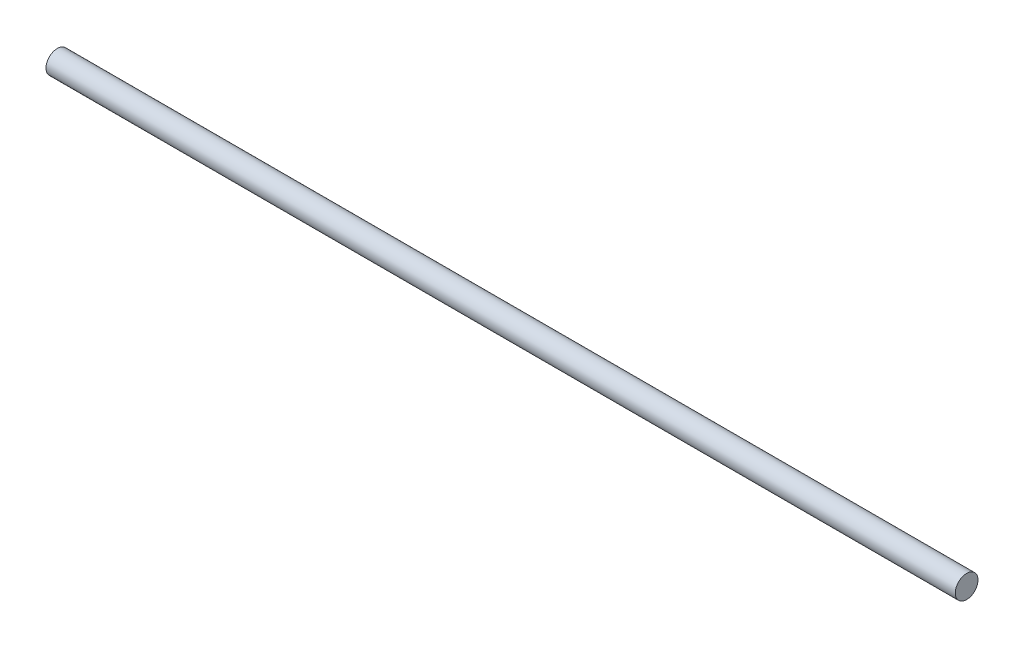
ISO-10303-21;
HEADER;
FILE_DESCRIPTION(('STEP AP214'),'2;1');
FILE_NAME('part.step','',(''),(''),'','','');
FILE_SCHEMA(('AUTOMOTIVE_DESIGN { 1 0 10303 214 1 1 1 1 }'));
ENDSEC;
DATA;
#1=APPLICATION_CONTEXT('core data for automotive mechanical design processes');
#2=APPLICATION_PROTOCOL_DEFINITION('international standard','automotive_design',2000,#1);
#3=PRODUCT_CONTEXT('',#1,'mechanical');
#4=PRODUCT('Part','Part','',(#3));
#5=PRODUCT_RELATED_PRODUCT_CATEGORY('part','',(#4));
#6=PRODUCT_DEFINITION_FORMATION('','',#4);
#7=PRODUCT_DEFINITION_CONTEXT('part definition',#1,'design');
#8=PRODUCT_DEFINITION('design','',#6,#7);
#9=PRODUCT_DEFINITION_SHAPE('','',#8);
#10=(LENGTH_UNIT() NAMED_UNIT(*) SI_UNIT(.MILLI.,.METRE.));
#11=(NAMED_UNIT(*) PLANE_ANGLE_UNIT() SI_UNIT($,.RADIAN.));
#12=(NAMED_UNIT(*) SI_UNIT($,.STERADIAN.) SOLID_ANGLE_UNIT());
#13=UNCERTAINTY_MEASURE_WITH_UNIT(LENGTH_MEASURE(1.E-05),#10,'distance_accuracy_value','');
#14=(GEOMETRIC_REPRESENTATION_CONTEXT(3) GLOBAL_UNCERTAINTY_ASSIGNED_CONTEXT((#13)) GLOBAL_UNIT_ASSIGNED_CONTEXT((#10,
#11,#12)) REPRESENTATION_CONTEXT('',''));
#15=CARTESIAN_POINT('',(0.,0.,0.));
#16=DIRECTION('',(0.,0.,1.));
#17=DIRECTION('',(1.,0.,0.));
#18=AXIS2_PLACEMENT_3D('',#15,#16,#17);
#19=CARTESIAN_POINT('',(40.,0.,0.));
#20=DIRECTION('',(-1.,0.,0.));
#21=DIRECTION('',(0.,0.,1.));
#22=AXIS2_PLACEMENT_3D('',#19,#20,#21);
#23=CYLINDRICAL_SURFACE('',#22,0.5);
#24=CARTESIAN_POINT('',(40.,0.,0.));
#25=DIRECTION('',(1.,0.,0.));
#26=DIRECTION('',(0.,0.,-1.));
#27=AXIS2_PLACEMENT_3D('',#24,#25,#26);
#28=CIRCLE('',#27,0.5);
#29=CARTESIAN_POINT('',(40.,0.,-0.5));
#30=VERTEX_POINT('',#29);
#31=EDGE_CURVE('E10',#30,#30,#28,.T.);
#32=ORIENTED_EDGE('',*,*,#31,.F.);
#33=EDGE_LOOP('',(#32));
#34=FACE_BOUND('',#33,.T.);
#35=CARTESIAN_POINT('',(0.,0.,0.));
#36=DIRECTION('',(1.,0.,0.));
#37=DIRECTION('',(0.,0.,-1.));
#38=AXIS2_PLACEMENT_3D('',#35,#36,#37);
#39=CIRCLE('',#38,0.5);
#40=CARTESIAN_POINT('',(0.,0.,-0.5));
#41=VERTEX_POINT('',#40);
#42=EDGE_CURVE('E35',#41,#41,#39,.T.);
#43=ORIENTED_EDGE('',*,*,#42,.T.);
#44=EDGE_LOOP('',(#43));
#45=FACE_BOUND('',#44,.T.);
#46=ADVANCED_FACE('F32',(#34,#45),#23,.T.);
#47=CARTESIAN_POINT('',(40.,0.,0.));
#48=DIRECTION('',(1.,0.,0.));
#49=DIRECTION('',(0.,0.,-1.));
#50=AXIS2_PLACEMENT_3D('',#47,#48,#49);
#51=PLANE('',#50);
#52=ORIENTED_EDGE('',*,*,#31,.T.);
#53=EDGE_LOOP('',(#52));
#54=FACE_BOUND('',#53,.T.);
#55=ADVANCED_FACE('F47',(#54),#51,.T.);
#56=CARTESIAN_POINT('',(0.,0.,0.));
#57=DIRECTION('',(1.,0.,0.));
#58=DIRECTION('',(0.,0.,-1.));
#59=AXIS2_PLACEMENT_3D('',#56,#57,#58);
#60=PLANE('',#59);
#61=ORIENTED_EDGE('',*,*,#42,.F.);
#62=EDGE_LOOP('',(#61));
#63=FACE_BOUND('',#62,.T.);
#64=ADVANCED_FACE('F45',(#63),#60,.F.);
#65=CLOSED_SHELL('',(#46,#55,#64));
#66=MANIFOLD_SOLID_BREP('B2',#65);
#67=ADVANCED_BREP_SHAPE_REPRESENTATION('',(#18,#66),#14);
#68=SHAPE_DEFINITION_REPRESENTATION(#9,#67);
ENDSEC;
END-ISO-10303-21;
